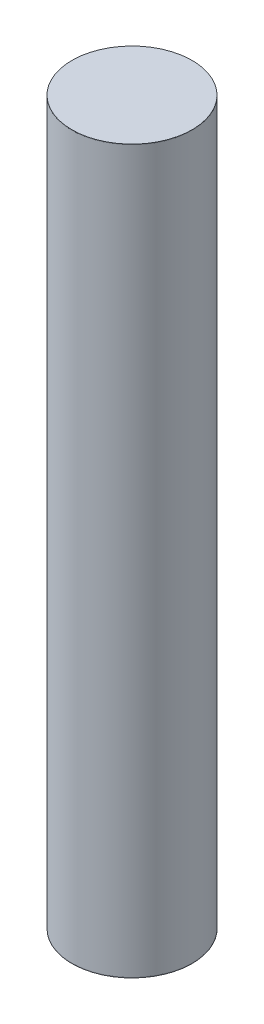
ISO-10303-21;
HEADER;
FILE_DESCRIPTION(('STEP AP214'),'2;1');
FILE_NAME('part.step','',(''),(''),'','','');
FILE_SCHEMA(('AUTOMOTIVE_DESIGN { 1 0 10303 214 1 1 1 1 }'));
ENDSEC;
DATA;
#1=APPLICATION_CONTEXT('core data for automotive mechanical design processes');
#2=APPLICATION_PROTOCOL_DEFINITION('international standard','automotive_design',2000,#1);
#3=PRODUCT_CONTEXT('',#1,'mechanical');
#4=PRODUCT('Part','Part','',(#3));
#5=PRODUCT_RELATED_PRODUCT_CATEGORY('part','',(#4));
#6=PRODUCT_DEFINITION_FORMATION('','',#4);
#7=PRODUCT_DEFINITION_CONTEXT('part definition',#1,'design');
#8=PRODUCT_DEFINITION('design','',#6,#7);
#9=PRODUCT_DEFINITION_SHAPE('','',#8);
#10=(LENGTH_UNIT() NAMED_UNIT(*) SI_UNIT(.MILLI.,.METRE.));
#11=(NAMED_UNIT(*) PLANE_ANGLE_UNIT() SI_UNIT($,.RADIAN.));
#12=(NAMED_UNIT(*) SI_UNIT($,.STERADIAN.) SOLID_ANGLE_UNIT());
#13=UNCERTAINTY_MEASURE_WITH_UNIT(LENGTH_MEASURE(1.E-05),#10,'distance_accuracy_value','');
#14=(GEOMETRIC_REPRESENTATION_CONTEXT(3) GLOBAL_UNCERTAINTY_ASSIGNED_CONTEXT((#13)) GLOBAL_UNIT_ASSIGNED_CONTEXT((#10,
#11,#12)) REPRESENTATION_CONTEXT('',''));
#15=CARTESIAN_POINT('',(0.,0.,0.));
#16=DIRECTION('',(0.,0.,1.));
#17=DIRECTION('',(1.,0.,0.));
#18=AXIS2_PLACEMENT_3D('',#15,#16,#17);
#19=CARTESIAN_POINT('',(0.,-1.,0.));
#20=DIRECTION('',(0.,1.,0.));
#21=DIRECTION('',(0.,0.,1.));
#22=AXIS2_PLACEMENT_3D('',#19,#20,#21);
#23=CYLINDRICAL_SURFACE('',#22,152.4);
#24=CARTESIAN_POINT('',(0.,0.,0.));
#25=DIRECTION('',(0.,-1.,0.));
#26=DIRECTION('',(0.,0.,-1.));
#27=AXIS2_PLACEMENT_3D('',#24,#25,#26);
#28=CIRCLE('',#27,152.4);
#29=CARTESIAN_POINT('',(0.,0.,-152.4));
#30=VERTEX_POINT('',#29);
#31=EDGE_CURVE('P0_E48',#30,#30,#28,.T.);
#32=ORIENTED_EDGE('',*,*,#31,.T.);
#33=EDGE_LOOP('',(#32));
#34=FACE_BOUND('',#33,.T.);
#35=CARTESIAN_POINT('',(0.,-1.,0.));
#36=DIRECTION('',(0.,-1.,0.));
#37=DIRECTION('',(0.,0.,-1.));
#38=AXIS2_PLACEMENT_3D('',#35,#36,#37);
#39=CIRCLE('',#38,152.4);
#40=CARTESIAN_POINT('',(0.,-1.,-152.4));
#41=VERTEX_POINT('',#40);
#42=EDGE_CURVE('P0_E11',#41,#41,#39,.T.);
#43=ORIENTED_EDGE('',*,*,#42,.F.);
#44=EDGE_LOOP('',(#43));
#45=FACE_BOUND('',#44,.T.);
#46=ADVANCED_FACE('P0_F45',(#34,#45),#23,.T.);
#47=CARTESIAN_POINT('',(0.,-1.,0.));
#48=DIRECTION('',(0.,-1.,0.));
#49=DIRECTION('',(0.,0.,-1.));
#50=AXIS2_PLACEMENT_3D('',#47,#48,#49);
#51=PLANE('',#50);
#52=ORIENTED_EDGE('',*,*,#42,.T.);
#53=EDGE_LOOP('',(#52));
#54=FACE_BOUND('',#53,.T.);
#55=ADVANCED_FACE('P0_F61',(#54),#51,.T.);
#56=CARTESIAN_POINT('',(0.,0.,0.));
#57=DIRECTION('',(0.,-1.,0.));
#58=DIRECTION('',(0.,0.,-1.));
#59=AXIS2_PLACEMENT_3D('',#56,#57,#58);
#60=PLANE('',#59);
#61=ORIENTED_EDGE('',*,*,#31,.F.);
#62=EDGE_LOOP('',(#61));
#63=FACE_BOUND('',#62,.T.);
#64=ADVANCED_FACE('P0_F59',(#63),#60,.F.);
#65=CLOSED_SHELL('',(#46,#55,#64));
#66=MANIFOLD_SOLID_BREP('P0_B2',#65);
#67=CARTESIAN_POINT('',(0.,1829.8,0.));
#68=DIRECTION('',(0.,-1.,0.));
#69=DIRECTION('',(0.,0.,-1.));
#70=AXIS2_PLACEMENT_3D('',#67,#68,#69);
#71=CYLINDRICAL_SURFACE('',#70,152.4);
#72=CARTESIAN_POINT('',(0.,1828.8,0.));
#73=DIRECTION('',(0.,1.,0.));
#74=DIRECTION('',(0.,0.,1.));
#75=AXIS2_PLACEMENT_3D('',#72,#73,#74);
#76=CIRCLE('',#75,152.4);
#77=CARTESIAN_POINT('',(0.,1828.8,152.4));
#78=VERTEX_POINT('',#77);
#79=EDGE_CURVE('P0_E92',#78,#78,#76,.T.);
#80=ORIENTED_EDGE('',*,*,#79,.T.);
#81=EDGE_LOOP('',(#80));
#82=FACE_BOUND('',#81,.T.);
#83=CARTESIAN_POINT('',(0.,1829.8,0.));
#84=DIRECTION('',(0.,1.,0.));
#85=DIRECTION('',(0.,0.,1.));
#86=AXIS2_PLACEMENT_3D('',#83,#84,#85);
#87=CIRCLE('',#86,152.4);
#88=CARTESIAN_POINT('',(0.,1829.8,152.4));
#89=VERTEX_POINT('',#88);
#90=EDGE_CURVE('P0_E44',#89,#89,#87,.T.);
#91=ORIENTED_EDGE('',*,*,#90,.F.);
#92=EDGE_LOOP('',(#91));
#93=FACE_BOUND('',#92,.T.);
#94=ADVANCED_FACE('P0_F89',(#82,#93),#71,.T.);
#95=CARTESIAN_POINT('',(0.,1829.8,0.));
#96=DIRECTION('',(0.,1.,0.));
#97=DIRECTION('',(0.,0.,1.));
#98=AXIS2_PLACEMENT_3D('',#95,#96,#97);
#99=PLANE('',#98);
#100=ORIENTED_EDGE('',*,*,#90,.T.);
#101=EDGE_LOOP('',(#100));
#102=FACE_BOUND('',#101,.T.);
#103=ADVANCED_FACE('P0_F105',(#102),#99,.T.);
#104=CARTESIAN_POINT('',(0.,1828.8,0.));
#105=DIRECTION('',(0.,1.,0.));
#106=DIRECTION('',(0.,0.,1.));
#107=AXIS2_PLACEMENT_3D('',#104,#105,#106);
#108=PLANE('',#107);
#109=ORIENTED_EDGE('',*,*,#79,.F.);
#110=EDGE_LOOP('',(#109));
#111=FACE_BOUND('',#110,.T.);
#112=ADVANCED_FACE('P0_F103',(#111),#108,.F.);
#113=CLOSED_SHELL('',(#94,#103,#112));
#114=MANIFOLD_SOLID_BREP('P0_B6',#113);
#115=CARTESIAN_POINT('',(142.875,1828.8,0.));
#116=DIRECTION('',(0.,1.,0.));
#117=DIRECTION('',(1.,0.,0.));
#118=AXIS2_PLACEMENT_3D('',#115,#116,#117);
#119=PLANE('',#118);
#120=CARTESIAN_POINT('',(0.,1828.8,0.));
#121=DIRECTION('',(0.,-1.,0.));
#122=DIRECTION('',(1.,0.,0.));
#123=AXIS2_PLACEMENT_3D('',#120,#121,#122);
#124=CIRCLE('',#123,152.4);
#125=CARTESIAN_POINT('',(0.,1828.8,-152.4));
#126=VERTEX_POINT('',#125);
#127=CARTESIAN_POINT('',(152.4,1828.8,0.));
#128=VERTEX_POINT('',#127);
#129=EDGE_CURVE('P1_E96',#126,#128,#124,.T.);
#130=ORIENTED_EDGE('',*,*,#129,.F.);
#131=CARTESIAN_POINT('',(0.,1828.8,0.));
#132=DIRECTION('',(0.,-1.,0.));
#133=DIRECTION('',(1.,0.,0.));
#134=AXIS2_PLACEMENT_3D('',#131,#132,#133);
#135=CIRCLE('',#134,152.4);
#136=EDGE_CURVE('P1_E98',#128,#126,#135,.T.);
#137=ORIENTED_EDGE('',*,*,#136,.F.);
#138=EDGE_LOOP('',(#130,#137));
#139=FACE_BOUND('',#138,.T.);
#140=CARTESIAN_POINT('',(0.,1828.8,0.));
#141=DIRECTION('',(0.,-1.,0.));
#142=DIRECTION('',(1.,0.,0.));
#143=AXIS2_PLACEMENT_3D('',#140,#141,#142);
#144=CIRCLE('',#143,142.875);
#145=CARTESIAN_POINT('',(142.875,1828.8,0.));
#146=VERTEX_POINT('',#145);
#147=CARTESIAN_POINT('',(0.,1828.8,-142.875));
#148=VERTEX_POINT('',#147);
#149=EDGE_CURVE('P1_E25',#146,#148,#144,.T.);
#150=ORIENTED_EDGE('',*,*,#149,.T.);
#151=CARTESIAN_POINT('',(0.,1828.8,0.));
#152=DIRECTION('',(0.,-1.,0.));
#153=DIRECTION('',(1.,0.,0.));
#154=AXIS2_PLACEMENT_3D('',#151,#152,#153);
#155=CIRCLE('',#154,142.875);
#156=EDGE_CURVE('P1_E10',#148,#146,#155,.T.);
#157=ORIENTED_EDGE('',*,*,#156,.T.);
#158=EDGE_LOOP('',(#150,#157));
#159=FACE_BOUND('',#158,.T.);
#160=ADVANCED_FACE('P1_F16',(#139,#159),#119,.T.);
#161=CARTESIAN_POINT('',(0.,914.4,0.));
#162=DIRECTION('',(0.,-1.,0.));
#163=DIRECTION('',(0.,0.,-1.));
#164=AXIS2_PLACEMENT_3D('',#161,#162,#163);
#165=CYLINDRICAL_SURFACE('',#164,142.875);
#166=DIRECTION('',(0.,1.,0.));
#167=VECTOR('',#166,1.);
#168=CARTESIAN_POINT('',(0.,0.,-142.875));
#169=LINE('',#168,#167);
#170=CARTESIAN_POINT('',(0.,0.,-142.875));
#171=VERTEX_POINT('',#170);
#172=EDGE_CURVE('P1_E19',#171,#148,#169,.T.);
#173=ORIENTED_EDGE('',*,*,#172,.F.);
#174=CARTESIAN_POINT('',(0.,0.,0.));
#175=DIRECTION('',(0.,-1.,0.));
#176=DIRECTION('',(1.,0.,0.));
#177=AXIS2_PLACEMENT_3D('',#174,#175,#176);
#178=CIRCLE('',#177,142.875);
#179=CARTESIAN_POINT('',(142.875,0.,0.));
#180=VERTEX_POINT('',#179);
#181=EDGE_CURVE('P1_E68',#171,#180,#178,.T.);
#182=ORIENTED_EDGE('',*,*,#181,.T.);
#183=CARTESIAN_POINT('',(0.,0.,0.));
#184=DIRECTION('',(0.,-1.,0.));
#185=DIRECTION('',(1.,0.,0.));
#186=AXIS2_PLACEMENT_3D('',#183,#184,#185);
#187=CIRCLE('',#186,142.875);
#188=EDGE_CURVE('P1_E70',#180,#171,#187,.T.);
#189=ORIENTED_EDGE('',*,*,#188,.T.);
#190=ORIENTED_EDGE('',*,*,#172,.T.);
#191=ORIENTED_EDGE('',*,*,#149,.F.);
#192=ORIENTED_EDGE('',*,*,#156,.F.);
#193=EDGE_LOOP('',(#173,#182,#189,#190,#191,#192));
#194=FACE_BOUND('',#193,.T.);
#195=ADVANCED_FACE('P1_F66',(#194),#165,.F.);
#196=CARTESIAN_POINT('',(152.4,0.,0.));
#197=DIRECTION('',(0.,-1.,0.));
#198=DIRECTION('',(0.,0.,-1.));
#199=AXIS2_PLACEMENT_3D('',#196,#197,#198);
#200=PLANE('',#199);
#201=ORIENTED_EDGE('',*,*,#181,.F.);
#202=ORIENTED_EDGE('',*,*,#188,.F.);
#203=EDGE_LOOP('',(#201,#202));
#204=FACE_BOUND('',#203,.T.);
#205=CARTESIAN_POINT('',(0.,0.,0.));
#206=DIRECTION('',(0.,-1.,0.));
#207=DIRECTION('',(1.,0.,0.));
#208=AXIS2_PLACEMENT_3D('',#205,#206,#207);
#209=CIRCLE('',#208,152.4);
#210=CARTESIAN_POINT('',(152.4,0.,0.));
#211=VERTEX_POINT('',#210);
#212=CARTESIAN_POINT('',(0.,0.,-152.4));
#213=VERTEX_POINT('',#212);
#214=EDGE_CURVE('P1_E82',#211,#213,#209,.T.);
#215=ORIENTED_EDGE('',*,*,#214,.T.);
#216=CARTESIAN_POINT('',(0.,0.,0.));
#217=DIRECTION('',(0.,-1.,0.));
#218=DIRECTION('',(1.,0.,0.));
#219=AXIS2_PLACEMENT_3D('',#216,#217,#218);
#220=CIRCLE('',#219,152.4);
#221=EDGE_CURVE('P1_E77',#213,#211,#220,.T.);
#222=ORIENTED_EDGE('',*,*,#221,.T.);
#223=EDGE_LOOP('',(#215,#222));
#224=FACE_BOUND('',#223,.T.);
#225=ADVANCED_FACE('P1_F74',(#204,#224),#200,.T.);
#226=CARTESIAN_POINT('',(0.,914.4,0.));
#227=DIRECTION('',(0.,-1.,0.));
#228=DIRECTION('',(0.,0.,-1.));
#229=AXIS2_PLACEMENT_3D('',#226,#227,#228);
#230=CYLINDRICAL_SURFACE('',#229,152.4);
#231=DIRECTION('',(0.,1.,0.));
#232=VECTOR('',#231,1.);
#233=CARTESIAN_POINT('',(0.,0.,-152.4));
#234=LINE('',#233,#232);
#235=EDGE_CURVE('P1_E101',#213,#126,#234,.T.);
#236=ORIENTED_EDGE('',*,*,#235,.T.);
#237=ORIENTED_EDGE('',*,*,#129,.T.);
#238=ORIENTED_EDGE('',*,*,#136,.T.);
#239=ORIENTED_EDGE('',*,*,#235,.F.);
#240=ORIENTED_EDGE('',*,*,#214,.F.);
#241=ORIENTED_EDGE('',*,*,#221,.F.);
#242=EDGE_LOOP('',(#236,#237,#238,#239,#240,#241));
#243=FACE_BOUND('',#242,.T.);
#244=ADVANCED_FACE('P1_F105',(#243),#230,.T.);
#245=CLOSED_SHELL('',(#160,#195,#225,#244));
#246=MANIFOLD_SOLID_BREP('P1_B1',#245);
#247=CARTESIAN_POINT('',(136.525,1828.8,0.));
#248=DIRECTION('',(0.,1.,0.));
#249=DIRECTION('',(1.,0.,0.));
#250=AXIS2_PLACEMENT_3D('',#247,#248,#249);
#251=PLANE('',#250);
#252=CARTESIAN_POINT('',(0.,1828.8,0.));
#253=DIRECTION('',(0.,-1.,0.));
#254=DIRECTION('',(1.,0.,0.));
#255=AXIS2_PLACEMENT_3D('',#252,#253,#254);
#256=CIRCLE('',#255,142.875);
#257=CARTESIAN_POINT('',(0.,1828.8,-142.875));
#258=VERTEX_POINT('',#257);
#259=CARTESIAN_POINT('',(142.875,1828.8,0.));
#260=VERTEX_POINT('',#259);
#261=EDGE_CURVE('P2_E83',#258,#260,#256,.T.);
#262=ORIENTED_EDGE('',*,*,#261,.F.);
#263=CARTESIAN_POINT('',(0.,1828.8,0.));
#264=DIRECTION('',(0.,-1.,0.));
#265=DIRECTION('',(1.,0.,0.));
#266=AXIS2_PLACEMENT_3D('',#263,#264,#265);
#267=CIRCLE('',#266,142.875);
#268=EDGE_CURVE('P2_E79',#260,#258,#267,.T.);
#269=ORIENTED_EDGE('',*,*,#268,.F.);
#270=EDGE_LOOP('',(#262,#269));
#271=FACE_BOUND('',#270,.T.);
#272=CARTESIAN_POINT('',(0.,1828.8,0.));
#273=DIRECTION('',(0.,-1.,0.));
#274=DIRECTION('',(1.,0.,0.));
#275=AXIS2_PLACEMENT_3D('',#272,#273,#274);
#276=CIRCLE('',#275,136.525);
#277=CARTESIAN_POINT('',(136.525,1828.8,0.));
#278=VERTEX_POINT('',#277);
#279=CARTESIAN_POINT('',(0.,1828.8,-136.525));
#280=VERTEX_POINT('',#279);
#281=EDGE_CURVE('P2_E25',#278,#280,#276,.T.);
#282=ORIENTED_EDGE('',*,*,#281,.T.);
#283=CARTESIAN_POINT('',(0.,1828.8,0.));
#284=DIRECTION('',(0.,-1.,0.));
#285=DIRECTION('',(1.,0.,0.));
#286=AXIS2_PLACEMENT_3D('',#283,#284,#285);
#287=CIRCLE('',#286,136.525);
#288=EDGE_CURVE('P2_E11',#280,#278,#287,.T.);
#289=ORIENTED_EDGE('',*,*,#288,.T.);
#290=EDGE_LOOP('',(#282,#289));
#291=FACE_BOUND('',#290,.T.);
#292=ADVANCED_FACE('P2_F17',(#271,#291),#251,.T.);
#293=CARTESIAN_POINT('',(0.,914.4,0.));
#294=DIRECTION('',(0.,-1.,0.));
#295=DIRECTION('',(0.,0.,-1.));
#296=AXIS2_PLACEMENT_3D('',#293,#294,#295);
#297=CYLINDRICAL_SURFACE('',#296,136.525);
#298=DIRECTION('',(0.,1.,0.));
#299=VECTOR('',#298,1.);
#300=CARTESIAN_POINT('',(0.,0.,-136.525));
#301=LINE('',#300,#299);
#302=CARTESIAN_POINT('',(0.,0.,-136.525));
#303=VERTEX_POINT('',#302);
#304=EDGE_CURVE('P2_E91',#303,#280,#301,.T.);
#305=ORIENTED_EDGE('',*,*,#304,.F.);
#306=CARTESIAN_POINT('',(0.,0.,0.));
#307=DIRECTION('',(0.,-1.,0.));
#308=DIRECTION('',(1.,0.,0.));
#309=AXIS2_PLACEMENT_3D('',#306,#307,#308);
#310=CIRCLE('',#309,136.525);
#311=CARTESIAN_POINT('',(136.525,0.,0.));
#312=VERTEX_POINT('',#311);
#313=EDGE_CURVE('P2_E75',#303,#312,#310,.T.);
#314=ORIENTED_EDGE('',*,*,#313,.T.);
#315=CARTESIAN_POINT('',(0.,0.,0.));
#316=DIRECTION('',(0.,-1.,0.));
#317=DIRECTION('',(1.,0.,0.));
#318=AXIS2_PLACEMENT_3D('',#315,#316,#317);
#319=CIRCLE('',#318,136.525);
#320=EDGE_CURVE('P2_E94',#312,#303,#319,.T.);
#321=ORIENTED_EDGE('',*,*,#320,.T.);
#322=ORIENTED_EDGE('',*,*,#304,.T.);
#323=ORIENTED_EDGE('',*,*,#281,.F.);
#324=ORIENTED_EDGE('',*,*,#288,.F.);
#325=EDGE_LOOP('',(#305,#314,#321,#322,#323,#324));
#326=FACE_BOUND('',#325,.T.);
#327=ADVANCED_FACE('P2_F104',(#326),#297,.F.);
#328=CARTESIAN_POINT('',(152.4,0.,0.));
#329=DIRECTION('',(0.,-1.,0.));
#330=DIRECTION('',(0.,0.,-1.));
#331=AXIS2_PLACEMENT_3D('',#328,#329,#330);
#332=PLANE('',#331);
#333=ORIENTED_EDGE('',*,*,#313,.F.);
#334=ORIENTED_EDGE('',*,*,#320,.F.);
#335=EDGE_LOOP('',(#333,#334));
#336=FACE_BOUND('',#335,.T.);
#337=CARTESIAN_POINT('',(0.,0.,0.));
#338=DIRECTION('',(0.,-1.,0.));
#339=DIRECTION('',(1.,0.,0.));
#340=AXIS2_PLACEMENT_3D('',#337,#338,#339);
#341=CIRCLE('',#340,142.875);
#342=CARTESIAN_POINT('',(142.875,0.,0.));
#343=VERTEX_POINT('',#342);
#344=CARTESIAN_POINT('',(0.,0.,-142.875));
#345=VERTEX_POINT('',#344);
#346=EDGE_CURVE('P2_E72',#343,#345,#341,.T.);
#347=ORIENTED_EDGE('',*,*,#346,.T.);
#348=CARTESIAN_POINT('',(0.,0.,0.));
#349=DIRECTION('',(0.,-1.,0.));
#350=DIRECTION('',(1.,0.,0.));
#351=AXIS2_PLACEMENT_3D('',#348,#349,#350);
#352=CIRCLE('',#351,142.875);
#353=EDGE_CURVE('P2_E66',#345,#343,#352,.T.);
#354=ORIENTED_EDGE('',*,*,#353,.T.);
#355=EDGE_LOOP('',(#347,#354));
#356=FACE_BOUND('',#355,.T.);
#357=ADVANCED_FACE('P2_F77',(#336,#356),#332,.T.);
#358=CARTESIAN_POINT('',(0.,914.4,0.));
#359=DIRECTION('',(0.,-1.,0.));
#360=DIRECTION('',(0.,0.,-1.));
#361=AXIS2_PLACEMENT_3D('',#358,#359,#360);
#362=CYLINDRICAL_SURFACE('',#361,142.875);
#363=DIRECTION('',(0.,1.,0.));
#364=VECTOR('',#363,1.);
#365=CARTESIAN_POINT('',(0.,0.,-142.875));
#366=LINE('',#365,#364);
#367=EDGE_CURVE('P2_E71',#345,#258,#366,.T.);
#368=ORIENTED_EDGE('',*,*,#367,.T.);
#369=ORIENTED_EDGE('',*,*,#261,.T.);
#370=ORIENTED_EDGE('',*,*,#268,.T.);
#371=ORIENTED_EDGE('',*,*,#367,.F.);
#372=ORIENTED_EDGE('',*,*,#346,.F.);
#373=ORIENTED_EDGE('',*,*,#353,.F.);
#374=EDGE_LOOP('',(#368,#369,#370,#371,#372,#373));
#375=FACE_BOUND('',#374,.T.);
#376=ADVANCED_FACE('P2_F68',(#375),#362,.T.);
#377=CLOSED_SHELL('',(#292,#327,#357,#376));
#378=MANIFOLD_SOLID_BREP('P2_B1',#377);
#379=CARTESIAN_POINT('',(135.89,1828.8,0.));
#380=DIRECTION('',(0.,1.,0.));
#381=DIRECTION('',(1.,0.,0.));
#382=AXIS2_PLACEMENT_3D('',#379,#380,#381);
#383=PLANE('',#382);
#384=CARTESIAN_POINT('',(0.,1828.8,0.));
#385=DIRECTION('',(0.,-1.,0.));
#386=DIRECTION('',(1.,0.,0.));
#387=AXIS2_PLACEMENT_3D('',#384,#385,#386);
#388=CIRCLE('',#387,136.525);
#389=CARTESIAN_POINT('',(0.,1828.8,-136.525));
#390=VERTEX_POINT('',#389);
#391=CARTESIAN_POINT('',(136.525,1828.8,0.));
#392=VERTEX_POINT('',#391);
#393=EDGE_CURVE('P3_E85',#390,#392,#388,.T.);
#394=ORIENTED_EDGE('',*,*,#393,.F.);
#395=CARTESIAN_POINT('',(0.,1828.8,0.));
#396=DIRECTION('',(0.,-1.,0.));
#397=DIRECTION('',(1.,0.,0.));
#398=AXIS2_PLACEMENT_3D('',#395,#396,#397);
#399=CIRCLE('',#398,136.525);
#400=EDGE_CURVE('P3_E81',#392,#390,#399,.T.);
#401=ORIENTED_EDGE('',*,*,#400,.F.);
#402=EDGE_LOOP('',(#394,#401));
#403=FACE_BOUND('',#402,.T.);
#404=CARTESIAN_POINT('',(0.,1828.8,0.));
#405=DIRECTION('',(0.,-1.,0.));
#406=DIRECTION('',(1.,0.,0.));
#407=AXIS2_PLACEMENT_3D('',#404,#405,#406);
#408=CIRCLE('',#407,135.89);
#409=CARTESIAN_POINT('',(135.89,1828.8,0.));
#410=VERTEX_POINT('',#409);
#411=CARTESIAN_POINT('',(0.,1828.8,-135.89));
#412=VERTEX_POINT('',#411);
#413=EDGE_CURVE('P3_E20',#410,#412,#408,.T.);
#414=ORIENTED_EDGE('',*,*,#413,.T.);
#415=CARTESIAN_POINT('',(0.,1828.8,0.));
#416=DIRECTION('',(0.,-1.,0.));
#417=DIRECTION('',(1.,0.,0.));
#418=AXIS2_PLACEMENT_3D('',#415,#416,#417);
#419=CIRCLE('',#418,135.89);
#420=EDGE_CURVE('P3_E11',#412,#410,#419,.T.);
#421=ORIENTED_EDGE('',*,*,#420,.T.);
#422=EDGE_LOOP('',(#414,#421));
#423=FACE_BOUND('',#422,.T.);
#424=ADVANCED_FACE('P3_F17',(#403,#423),#383,.T.);
#425=CARTESIAN_POINT('',(0.,914.4,0.));
#426=DIRECTION('',(0.,-1.,0.));
#427=DIRECTION('',(0.,0.,-1.));
#428=AXIS2_PLACEMENT_3D('',#425,#426,#427);
#429=CYLINDRICAL_SURFACE('',#428,135.89);
#430=DIRECTION('',(0.,1.,0.));
#431=VECTOR('',#430,1.);
#432=CARTESIAN_POINT('',(0.,0.,-135.89));
#433=LINE('',#432,#431);
#434=CARTESIAN_POINT('',(0.,0.,-135.89));
#435=VERTEX_POINT('',#434);
#436=EDGE_CURVE('P3_E93',#435,#412,#433,.T.);
#437=ORIENTED_EDGE('',*,*,#436,.F.);
#438=CARTESIAN_POINT('',(0.,0.,0.));
#439=DIRECTION('',(0.,-1.,0.));
#440=DIRECTION('',(1.,0.,0.));
#441=AXIS2_PLACEMENT_3D('',#438,#439,#440);
#442=CIRCLE('',#441,135.89);
#443=CARTESIAN_POINT('',(135.89,0.,0.));
#444=VERTEX_POINT('',#443);
#445=EDGE_CURVE('P3_E77',#435,#444,#442,.T.);
#446=ORIENTED_EDGE('',*,*,#445,.T.);
#447=CARTESIAN_POINT('',(0.,0.,0.));
#448=DIRECTION('',(0.,-1.,0.));
#449=DIRECTION('',(1.,0.,0.));
#450=AXIS2_PLACEMENT_3D('',#447,#448,#449);
#451=CIRCLE('',#450,135.89);
#452=EDGE_CURVE('P3_E96',#444,#435,#451,.T.);
#453=ORIENTED_EDGE('',*,*,#452,.T.);
#454=ORIENTED_EDGE('',*,*,#436,.T.);
#455=ORIENTED_EDGE('',*,*,#413,.F.);
#456=ORIENTED_EDGE('',*,*,#420,.F.);
#457=EDGE_LOOP('',(#437,#446,#453,#454,#455,#456));
#458=FACE_BOUND('',#457,.T.);
#459=ADVANCED_FACE('P3_F106',(#458),#429,.F.);
#460=CARTESIAN_POINT('',(152.4,0.,0.));
#461=DIRECTION('',(0.,-1.,0.));
#462=DIRECTION('',(0.,0.,-1.));
#463=AXIS2_PLACEMENT_3D('',#460,#461,#462);
#464=PLANE('',#463);
#465=ORIENTED_EDGE('',*,*,#445,.F.);
#466=ORIENTED_EDGE('',*,*,#452,.F.);
#467=EDGE_LOOP('',(#465,#466));
#468=FACE_BOUND('',#467,.T.);
#469=CARTESIAN_POINT('',(0.,0.,0.));
#470=DIRECTION('',(0.,-1.,0.));
#471=DIRECTION('',(1.,0.,0.));
#472=AXIS2_PLACEMENT_3D('',#469,#470,#471);
#473=CIRCLE('',#472,136.525);
#474=CARTESIAN_POINT('',(136.525,0.,0.));
#475=VERTEX_POINT('',#474);
#476=CARTESIAN_POINT('',(0.,0.,-136.525));
#477=VERTEX_POINT('',#476);
#478=EDGE_CURVE('P3_E74',#475,#477,#473,.T.);
#479=ORIENTED_EDGE('',*,*,#478,.T.);
#480=CARTESIAN_POINT('',(0.,0.,0.));
#481=DIRECTION('',(0.,-1.,0.));
#482=DIRECTION('',(1.,0.,0.));
#483=AXIS2_PLACEMENT_3D('',#480,#481,#482);
#484=CIRCLE('',#483,136.525);
#485=EDGE_CURVE('P3_E68',#477,#475,#484,.T.);
#486=ORIENTED_EDGE('',*,*,#485,.T.);
#487=EDGE_LOOP('',(#479,#486));
#488=FACE_BOUND('',#487,.T.);
#489=ADVANCED_FACE('P3_F79',(#468,#488),#464,.T.);
#490=CARTESIAN_POINT('',(0.,914.4,0.));
#491=DIRECTION('',(0.,-1.,0.));
#492=DIRECTION('',(0.,0.,-1.));
#493=AXIS2_PLACEMENT_3D('',#490,#491,#492);
#494=CYLINDRICAL_SURFACE('',#493,136.525);
#495=DIRECTION('',(0.,1.,0.));
#496=VECTOR('',#495,1.);
#497=CARTESIAN_POINT('',(0.,0.,-136.525));
#498=LINE('',#497,#496);
#499=EDGE_CURVE('P3_E73',#477,#390,#498,.T.);
#500=ORIENTED_EDGE('',*,*,#499,.T.);
#501=ORIENTED_EDGE('',*,*,#393,.T.);
#502=ORIENTED_EDGE('',*,*,#400,.T.);
#503=ORIENTED_EDGE('',*,*,#499,.F.);
#504=ORIENTED_EDGE('',*,*,#478,.F.);
#505=ORIENTED_EDGE('',*,*,#485,.F.);
#506=EDGE_LOOP('',(#500,#501,#502,#503,#504,#505));
#507=FACE_BOUND('',#506,.T.);
#508=ADVANCED_FACE('P3_F70',(#507),#494,.T.);
#509=CLOSED_SHELL('',(#424,#459,#489,#508));
#510=MANIFOLD_SOLID_BREP('P3_B1',#509);
#511=CARTESIAN_POINT('',(133.35,1828.8,0.));
#512=DIRECTION('',(0.,1.,0.));
#513=DIRECTION('',(1.,0.,0.));
#514=AXIS2_PLACEMENT_3D('',#511,#512,#513);
#515=PLANE('',#514);
#516=CARTESIAN_POINT('',(0.,1828.8,0.));
#517=DIRECTION('',(0.,-1.,0.));
#518=DIRECTION('',(1.,0.,0.));
#519=AXIS2_PLACEMENT_3D('',#516,#517,#518);
#520=CIRCLE('',#519,135.89);
#521=CARTESIAN_POINT('',(0.,1828.8,-135.89));
#522=VERTEX_POINT('',#521);
#523=CARTESIAN_POINT('',(135.89,1828.8,0.));
#524=VERTEX_POINT('',#523);
#525=EDGE_CURVE('P4_E86',#522,#524,#520,.T.);
#526=ORIENTED_EDGE('',*,*,#525,.F.);
#527=CARTESIAN_POINT('',(0.,1828.8,0.));
#528=DIRECTION('',(0.,-1.,0.));
#529=DIRECTION('',(1.,0.,0.));
#530=AXIS2_PLACEMENT_3D('',#527,#528,#529);
#531=CIRCLE('',#530,135.89);
#532=EDGE_CURVE('P4_E82',#524,#522,#531,.T.);
#533=ORIENTED_EDGE('',*,*,#532,.F.);
#534=EDGE_LOOP('',(#526,#533));
#535=FACE_BOUND('',#534,.T.);
#536=CARTESIAN_POINT('',(0.,1828.8,0.));
#537=DIRECTION('',(0.,-1.,0.));
#538=DIRECTION('',(1.,0.,0.));
#539=AXIS2_PLACEMENT_3D('',#536,#537,#538);
#540=CIRCLE('',#539,133.35);
#541=CARTESIAN_POINT('',(133.35,1828.8,0.));
#542=VERTEX_POINT('',#541);
#543=CARTESIAN_POINT('',(0.,1828.8,-133.35));
#544=VERTEX_POINT('',#543);
#545=EDGE_CURVE('P4_E26',#542,#544,#540,.T.);
#546=ORIENTED_EDGE('',*,*,#545,.T.);
#547=CARTESIAN_POINT('',(0.,1828.8,0.));
#548=DIRECTION('',(0.,-1.,0.));
#549=DIRECTION('',(1.,0.,0.));
#550=AXIS2_PLACEMENT_3D('',#547,#548,#549);
#551=CIRCLE('',#550,133.35);
#552=EDGE_CURVE('P4_E11',#544,#542,#551,.T.);
#553=ORIENTED_EDGE('',*,*,#552,.T.);
#554=EDGE_LOOP('',(#546,#553));
#555=FACE_BOUND('',#554,.T.);
#556=ADVANCED_FACE('P4_F17',(#535,#555),#515,.T.);
#557=CARTESIAN_POINT('',(0.,914.4,0.));
#558=DIRECTION('',(0.,-1.,0.));
#559=DIRECTION('',(0.,0.,-1.));
#560=AXIS2_PLACEMENT_3D('',#557,#558,#559);
#561=CYLINDRICAL_SURFACE('',#560,133.35);
#562=DIRECTION('',(0.,1.,0.));
#563=VECTOR('',#562,1.);
#564=CARTESIAN_POINT('',(0.,0.,-133.35));
#565=LINE('',#564,#563);
#566=CARTESIAN_POINT('',(0.,0.,-133.35));
#567=VERTEX_POINT('',#566);
#568=EDGE_CURVE('P4_E20',#567,#544,#565,.T.);
#569=ORIENTED_EDGE('',*,*,#568,.F.);
#570=CARTESIAN_POINT('',(0.,0.,0.));
#571=DIRECTION('',(0.,-1.,0.));
#572=DIRECTION('',(1.,0.,0.));
#573=AXIS2_PLACEMENT_3D('',#570,#571,#572);
#574=CIRCLE('',#573,133.35);
#575=CARTESIAN_POINT('',(133.35,0.,0.));
#576=VERTEX_POINT('',#575);
#577=EDGE_CURVE('P4_E78',#567,#576,#574,.T.);
#578=ORIENTED_EDGE('',*,*,#577,.T.);
#579=CARTESIAN_POINT('',(0.,0.,0.));
#580=DIRECTION('',(0.,-1.,0.));
#581=DIRECTION('',(1.,0.,0.));
#582=AXIS2_PLACEMENT_3D('',#579,#580,#581);
#583=CIRCLE('',#582,133.35);
#584=EDGE_CURVE('P4_E96',#576,#567,#583,.T.);
#585=ORIENTED_EDGE('',*,*,#584,.T.);
#586=ORIENTED_EDGE('',*,*,#568,.T.);
#587=ORIENTED_EDGE('',*,*,#545,.F.);
#588=ORIENTED_EDGE('',*,*,#552,.F.);
#589=EDGE_LOOP('',(#569,#578,#585,#586,#587,#588));
#590=FACE_BOUND('',#589,.T.);
#591=ADVANCED_FACE('P4_F108',(#590),#561,.F.);
#592=CARTESIAN_POINT('',(152.4,0.,0.));
#593=DIRECTION('',(0.,-1.,0.));
#594=DIRECTION('',(0.,0.,-1.));
#595=AXIS2_PLACEMENT_3D('',#592,#593,#594);
#596=PLANE('',#595);
#597=ORIENTED_EDGE('',*,*,#577,.F.);
#598=ORIENTED_EDGE('',*,*,#584,.F.);
#599=EDGE_LOOP('',(#597,#598));
#600=FACE_BOUND('',#599,.T.);
#601=CARTESIAN_POINT('',(0.,0.,0.));
#602=DIRECTION('',(0.,-1.,0.));
#603=DIRECTION('',(1.,0.,0.));
#604=AXIS2_PLACEMENT_3D('',#601,#602,#603);
#605=CIRCLE('',#604,135.89);
#606=CARTESIAN_POINT('',(135.89,0.,0.));
#607=VERTEX_POINT('',#606);
#608=CARTESIAN_POINT('',(0.,0.,-135.89));
#609=VERTEX_POINT('',#608);
#610=EDGE_CURVE('P4_E75',#607,#609,#605,.T.);
#611=ORIENTED_EDGE('',*,*,#610,.T.);
#612=CARTESIAN_POINT('',(0.,0.,0.));
#613=DIRECTION('',(0.,-1.,0.));
#614=DIRECTION('',(1.,0.,0.));
#615=AXIS2_PLACEMENT_3D('',#612,#613,#614);
#616=CIRCLE('',#615,135.89);
#617=EDGE_CURVE('P4_E69',#609,#607,#616,.T.);
#618=ORIENTED_EDGE('',*,*,#617,.T.);
#619=EDGE_LOOP('',(#611,#618));
#620=FACE_BOUND('',#619,.T.);
#621=ADVANCED_FACE('P4_F80',(#600,#620),#596,.T.);
#622=CARTESIAN_POINT('',(0.,914.4,0.));
#623=DIRECTION('',(0.,-1.,0.));
#624=DIRECTION('',(0.,0.,-1.));
#625=AXIS2_PLACEMENT_3D('',#622,#623,#624);
#626=CYLINDRICAL_SURFACE('',#625,135.89);
#627=DIRECTION('',(0.,1.,0.));
#628=VECTOR('',#627,1.);
#629=CARTESIAN_POINT('',(0.,0.,-135.89));
#630=LINE('',#629,#628);
#631=EDGE_CURVE('P4_E74',#609,#522,#630,.T.);
#632=ORIENTED_EDGE('',*,*,#631,.T.);
#633=ORIENTED_EDGE('',*,*,#525,.T.);
#634=ORIENTED_EDGE('',*,*,#532,.T.);
#635=ORIENTED_EDGE('',*,*,#631,.F.);
#636=ORIENTED_EDGE('',*,*,#610,.F.);
#637=ORIENTED_EDGE('',*,*,#617,.F.);
#638=EDGE_LOOP('',(#632,#633,#634,#635,#636,#637));
#639=FACE_BOUND('',#638,.T.);
#640=ADVANCED_FACE('P4_F71',(#639),#626,.T.);
#641=CLOSED_SHELL('',(#556,#591,#621,#640));
#642=MANIFOLD_SOLID_BREP('P4_B1',#641);
#643=ADVANCED_BREP_SHAPE_REPRESENTATION('',(#18,#66,#114,#246,#378,#510,#642),#14);
#644=SHAPE_DEFINITION_REPRESENTATION(#9,#643);
ENDSEC;
END-ISO-10303-21;
